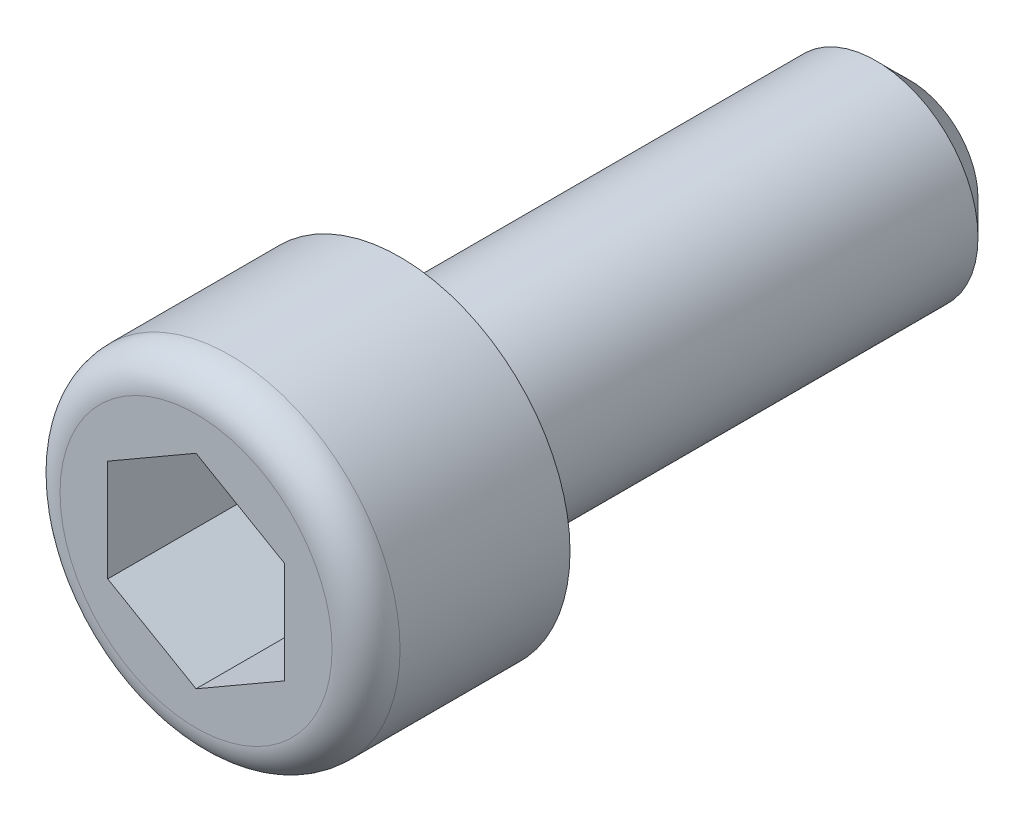
ISO-10303-21;
HEADER;
FILE_DESCRIPTION(('STEP AP214'),'2;1');
FILE_NAME('part.step','',(''),(''),'','','');
FILE_SCHEMA(('AUTOMOTIVE_DESIGN { 1 0 10303 214 1 1 1 1 }'));
ENDSEC;
DATA;
#1=APPLICATION_CONTEXT('core data for automotive mechanical design processes');
#2=APPLICATION_PROTOCOL_DEFINITION('international standard','automotive_design',2000,#1);
#3=PRODUCT_CONTEXT('',#1,'mechanical');
#4=PRODUCT('Part','Part','',(#3));
#5=PRODUCT_RELATED_PRODUCT_CATEGORY('part','',(#4));
#6=PRODUCT_DEFINITION_FORMATION('','',#4);
#7=PRODUCT_DEFINITION_CONTEXT('part definition',#1,'design');
#8=PRODUCT_DEFINITION('design','',#6,#7);
#9=PRODUCT_DEFINITION_SHAPE('','',#8);
#10=(LENGTH_UNIT() NAMED_UNIT(*) SI_UNIT(.MILLI.,.METRE.));
#11=(NAMED_UNIT(*) PLANE_ANGLE_UNIT() SI_UNIT($,.RADIAN.));
#12=(NAMED_UNIT(*) SI_UNIT($,.STERADIAN.) SOLID_ANGLE_UNIT());
#13=UNCERTAINTY_MEASURE_WITH_UNIT(LENGTH_MEASURE(1.E-05),#10,'distance_accuracy_value','');
#14=(GEOMETRIC_REPRESENTATION_CONTEXT(3) GLOBAL_UNCERTAINTY_ASSIGNED_CONTEXT((#13)) GLOBAL_UNIT_ASSIGNED_CONTEXT((#10,
#11,#12)) REPRESENTATION_CONTEXT('',''));
#15=CARTESIAN_POINT('',(0.,0.,0.));
#16=DIRECTION('',(0.,0.,1.));
#17=DIRECTION('',(1.,0.,0.));
#18=AXIS2_PLACEMENT_3D('',#15,#16,#17);
#19=CARTESIAN_POINT('',(0.,0.,0.));
#20=DIRECTION('',(0.,0.,-1.));
#21=DIRECTION('',(-1.,0.,0.));
#22=AXIS2_PLACEMENT_3D('',#19,#20,#21);
#23=PLANE('',#22);
#24=CARTESIAN_POINT('',(0.,0.,0.));
#25=DIRECTION('',(0.,0.,-1.));
#26=DIRECTION('',(-1.,0.,0.));
#27=AXIS2_PLACEMENT_3D('',#24,#25,#26);
#28=CIRCLE('',#27,4.);
#29=CARTESIAN_POINT('',(-4.,0.,0.));
#30=VERTEX_POINT('',#29);
#31=EDGE_CURVE('E40',#30,#30,#28,.F.);
#32=ORIENTED_EDGE('',*,*,#31,.T.);
#33=EDGE_LOOP('',(#32));
#34=FACE_BOUND('',#33,.T.);
#35=DIRECTION('',(-0.866025403784439,-0.5,0.));
#36=VECTOR('',#35,1.);
#37=CARTESIAN_POINT('',(0.,3.,0.));
#38=LINE('',#37,#36);
#39=CARTESIAN_POINT('',(0.,3.,0.));
#40=VERTEX_POINT('',#39);
#41=CARTESIAN_POINT('',(-2.59807621135332,1.5,0.));
#42=VERTEX_POINT('',#41);
#43=EDGE_CURVE('E121',#40,#42,#38,.T.);
#44=ORIENTED_EDGE('',*,*,#43,.F.);
#45=DIRECTION('',(-0.866025403784439,0.5,0.));
#46=VECTOR('',#45,1.);
#47=CARTESIAN_POINT('',(2.59807621135332,1.5,0.));
#48=LINE('',#47,#46);
#49=CARTESIAN_POINT('',(2.59807621135332,1.5,0.));
#50=VERTEX_POINT('',#49);
#51=EDGE_CURVE('E47',#50,#40,#48,.T.);
#52=ORIENTED_EDGE('',*,*,#51,.F.);
#53=DIRECTION('',(0.,1.,0.));
#54=VECTOR('',#53,1.);
#55=CARTESIAN_POINT('',(2.59807621135332,-1.5,0.));
#56=LINE('',#55,#54);
#57=CARTESIAN_POINT('',(2.59807621135332,-1.5,0.));
#58=VERTEX_POINT('',#57);
#59=EDGE_CURVE('E130',#58,#50,#56,.T.);
#60=ORIENTED_EDGE('',*,*,#59,.F.);
#61=DIRECTION('',(0.866025403784439,0.5,0.));
#62=VECTOR('',#61,1.);
#63=CARTESIAN_POINT('',(0.,-3.,0.));
#64=LINE('',#63,#62);
#65=CARTESIAN_POINT('',(0.,-3.,0.));
#66=VERTEX_POINT('',#65);
#67=EDGE_CURVE('E128',#66,#58,#64,.T.);
#68=ORIENTED_EDGE('',*,*,#67,.F.);
#69=DIRECTION('',(0.866025403784439,-0.5,0.));
#70=VECTOR('',#69,1.);
#71=CARTESIAN_POINT('',(-2.59807621135332,-1.5,0.));
#72=LINE('',#71,#70);
#73=CARTESIAN_POINT('',(-2.59807621135332,-1.5,0.));
#74=VERTEX_POINT('',#73);
#75=EDGE_CURVE('E95',#74,#66,#72,.T.);
#76=ORIENTED_EDGE('',*,*,#75,.F.);
#77=DIRECTION('',(0.,-1.,0.));
#78=VECTOR('',#77,1.);
#79=CARTESIAN_POINT('',(-2.59807621135332,1.5,0.));
#80=LINE('',#79,#78);
#81=EDGE_CURVE('E124',#42,#74,#80,.T.);
#82=ORIENTED_EDGE('',*,*,#81,.F.);
#83=EDGE_LOOP('',(#44,#52,#60,#68,#76,#82));
#84=FACE_BOUND('',#83,.T.);
#85=ADVANCED_FACE('F32',(#34,#84),#23,.F.);
#86=CARTESIAN_POINT('',(0.,0.,156.291575098795));
#87=DIRECTION('',(0.,0.,1.));
#88=DIRECTION('',(1.,0.,0.));
#89=AXIS2_PLACEMENT_3D('',#86,#87,#88);
#90=CYLINDRICAL_SURFACE('',#89,5.);
#91=CARTESIAN_POINT('',(0.,0.,-1.));
#92=DIRECTION('',(0.,0.,-1.));
#93=DIRECTION('',(-1.,0.,0.));
#94=AXIS2_PLACEMENT_3D('',#91,#92,#93);
#95=CIRCLE('',#94,5.);
#96=CARTESIAN_POINT('',(-5.,0.,-1.));
#97=VERTEX_POINT('',#96);
#98=EDGE_CURVE('E11',#97,#97,#95,.T.);
#99=ORIENTED_EDGE('',*,*,#98,.T.);
#100=EDGE_LOOP('',(#99));
#101=FACE_BOUND('',#100,.T.);
#102=CARTESIAN_POINT('',(0.,0.,-6.00000000000001));
#103=DIRECTION('',(0.,0.,1.));
#104=DIRECTION('',(1.,0.,0.));
#105=AXIS2_PLACEMENT_3D('',#102,#103,#104);
#106=CIRCLE('',#105,5.);
#107=CARTESIAN_POINT('',(5.,0.,-6.00000000000001));
#108=VERTEX_POINT('',#107);
#109=EDGE_CURVE('E142',#108,#108,#106,.T.);
#110=ORIENTED_EDGE('',*,*,#109,.T.);
#111=EDGE_LOOP('',(#110));
#112=FACE_BOUND('',#111,.T.);
#113=ADVANCED_FACE('F164',(#101,#112),#90,.T.);
#114=CARTESIAN_POINT('',(0.,5.,-6.));
#115=DIRECTION('',(0.,0.,1.));
#116=DIRECTION('',(1.,0.,0.));
#117=AXIS2_PLACEMENT_3D('',#114,#115,#116);
#118=PLANE('',#117);
#119=ORIENTED_EDGE('',*,*,#109,.F.);
#120=EDGE_LOOP('',(#119));
#121=FACE_BOUND('',#120,.T.);
#122=CARTESIAN_POINT('',(0.,0.,-6.00000000000001));
#123=DIRECTION('',(0.,0.,1.));
#124=DIRECTION('',(1.,0.,0.));
#125=AXIS2_PLACEMENT_3D('',#122,#123,#124);
#126=CIRCLE('',#125,3.);
#127=CARTESIAN_POINT('',(3.,0.,-6.00000000000001));
#128=VERTEX_POINT('',#127);
#129=EDGE_CURVE('E134',#128,#128,#126,.T.);
#130=ORIENTED_EDGE('',*,*,#129,.T.);
#131=EDGE_LOOP('',(#130));
#132=FACE_BOUND('',#131,.T.);
#133=ADVANCED_FACE('F169',(#121,#132),#118,.F.);
#134=CARTESIAN_POINT('',(0.,0.,156.291575098795));
#135=DIRECTION('',(0.,0.,1.));
#136=DIRECTION('',(1.,0.,0.));
#137=AXIS2_PLACEMENT_3D('',#134,#135,#136);
#138=CYLINDRICAL_SURFACE('',#137,3.);
#139=CARTESIAN_POINT('',(0.,0.,-20.));
#140=DIRECTION('',(0.,0.,1.));
#141=DIRECTION('',(1.,0.,0.));
#142=AXIS2_PLACEMENT_3D('',#139,#140,#141);
#143=CIRCLE('',#142,3.);
#144=CARTESIAN_POINT('',(3.,0.,-20.));
#145=VERTEX_POINT('',#144);
#146=EDGE_CURVE('E145',#145,#145,#143,.T.);
#147=ORIENTED_EDGE('',*,*,#146,.T.);
#148=EDGE_LOOP('',(#147));
#149=FACE_BOUND('',#148,.T.);
#150=ORIENTED_EDGE('',*,*,#129,.F.);
#151=EDGE_LOOP('',(#150));
#152=FACE_BOUND('',#151,.T.);
#153=ADVANCED_FACE('F175',(#149,#152),#138,.T.);
#154=CARTESIAN_POINT('',(0.,3.,-21.));
#155=DIRECTION('',(0.,0.,1.));
#156=DIRECTION('',(1.,0.,0.));
#157=AXIS2_PLACEMENT_3D('',#154,#155,#156);
#158=PLANE('',#157);
#159=CARTESIAN_POINT('',(0.,0.,-21.));
#160=DIRECTION('',(0.,0.,1.));
#161=DIRECTION('',(1.,0.,0.));
#162=AXIS2_PLACEMENT_3D('',#159,#160,#161);
#163=CIRCLE('',#162,1.99999999999997);
#164=CARTESIAN_POINT('',(1.99999999999997,0.,-21.));
#165=VERTEX_POINT('',#164);
#166=EDGE_CURVE('E148',#165,#165,#163,.F.);
#167=ORIENTED_EDGE('',*,*,#166,.T.);
#168=EDGE_LOOP('',(#167));
#169=FACE_BOUND('',#168,.T.);
#170=ADVANCED_FACE('F179',(#169),#158,.F.);
#171=CARTESIAN_POINT('',(2.59807621135332,1.5,-4.5));
#172=DIRECTION('',(0.5,0.866025403784439,0.));
#173=DIRECTION('',(-0.866025403784439,0.5,0.));
#174=AXIS2_PLACEMENT_3D('',#171,#172,#173);
#175=PLANE('',#174);
#176=ORIENTED_EDGE('',*,*,#51,.T.);
#177=DIRECTION('',(0.,0.,1.));
#178=VECTOR('',#177,1.);
#179=CARTESIAN_POINT('',(0.,3.,-4.5));
#180=LINE('',#179,#178);
#181=CARTESIAN_POINT('',(0.,3.,-4.5));
#182=VERTEX_POINT('',#181);
#183=EDGE_CURVE('E77',#182,#40,#180,.T.);
#184=ORIENTED_EDGE('',*,*,#183,.F.);
#185=DIRECTION('',(-0.866025403784439,0.5,0.));
#186=VECTOR('',#185,1.);
#187=CARTESIAN_POINT('',(2.59807621135332,1.5,-4.5));
#188=LINE('',#187,#186);
#189=CARTESIAN_POINT('',(2.59807621135332,1.5,-4.5));
#190=VERTEX_POINT('',#189);
#191=EDGE_CURVE('E132',#190,#182,#188,.T.);
#192=ORIENTED_EDGE('',*,*,#191,.F.);
#193=DIRECTION('',(0.,0.,1.));
#194=VECTOR('',#193,1.);
#195=CARTESIAN_POINT('',(2.59807621135332,1.5,-4.5));
#196=LINE('',#195,#194);
#197=EDGE_CURVE('E55',#190,#50,#196,.T.);
#198=ORIENTED_EDGE('',*,*,#197,.T.);
#199=EDGE_LOOP('',(#176,#184,#192,#198));
#200=FACE_BOUND('',#199,.T.);
#201=ADVANCED_FACE('F183',(#200),#175,.F.);
#202=CARTESIAN_POINT('',(2.59807621135332,-1.5,-4.5));
#203=DIRECTION('',(1.,0.,0.));
#204=DIRECTION('',(0.,1.,0.));
#205=AXIS2_PLACEMENT_3D('',#202,#203,#204);
#206=PLANE('',#205);
#207=ORIENTED_EDGE('',*,*,#59,.T.);
#208=ORIENTED_EDGE('',*,*,#197,.F.);
#209=DIRECTION('',(0.,1.,0.));
#210=VECTOR('',#209,1.);
#211=CARTESIAN_POINT('',(2.59807621135332,-1.5,-4.5));
#212=LINE('',#211,#210);
#213=CARTESIAN_POINT('',(2.59807621135332,-1.5,-4.5));
#214=VERTEX_POINT('',#213);
#215=EDGE_CURVE('E107',#214,#190,#212,.T.);
#216=ORIENTED_EDGE('',*,*,#215,.F.);
#217=DIRECTION('',(0.,0.,1.));
#218=VECTOR('',#217,1.);
#219=CARTESIAN_POINT('',(2.59807621135332,-1.5,-4.5));
#220=LINE('',#219,#218);
#221=EDGE_CURVE('E99',#214,#58,#220,.T.);
#222=ORIENTED_EDGE('',*,*,#221,.T.);
#223=EDGE_LOOP('',(#207,#208,#216,#222));
#224=FACE_BOUND('',#223,.T.);
#225=ADVANCED_FACE('F187',(#224),#206,.F.);
#226=CARTESIAN_POINT('',(0.,-3.,-4.5));
#227=DIRECTION('',(0.5,-0.866025403784439,0.));
#228=DIRECTION('',(0.866025403784439,0.5,0.));
#229=AXIS2_PLACEMENT_3D('',#226,#227,#228);
#230=PLANE('',#229);
#231=ORIENTED_EDGE('',*,*,#67,.T.);
#232=ORIENTED_EDGE('',*,*,#221,.F.);
#233=DIRECTION('',(0.866025403784439,0.5,0.));
#234=VECTOR('',#233,1.);
#235=CARTESIAN_POINT('',(0.,-3.,-4.5));
#236=LINE('',#235,#234);
#237=CARTESIAN_POINT('',(0.,-3.,-4.5));
#238=VERTEX_POINT('',#237);
#239=EDGE_CURVE('E103',#238,#214,#236,.T.);
#240=ORIENTED_EDGE('',*,*,#239,.F.);
#241=DIRECTION('',(0.,0.,1.));
#242=VECTOR('',#241,1.);
#243=CARTESIAN_POINT('',(0.,-3.,-4.5));
#244=LINE('',#243,#242);
#245=EDGE_CURVE('E88',#238,#66,#244,.T.);
#246=ORIENTED_EDGE('',*,*,#245,.T.);
#247=EDGE_LOOP('',(#231,#232,#240,#246));
#248=FACE_BOUND('',#247,.T.);
#249=ADVANCED_FACE('F104',(#248),#230,.F.);
#250=CARTESIAN_POINT('',(-2.59807621135332,-1.5,-4.5));
#251=DIRECTION('',(-0.5,-0.866025403784439,0.));
#252=DIRECTION('',(0.866025403784439,-0.5,0.));
#253=AXIS2_PLACEMENT_3D('',#250,#251,#252);
#254=PLANE('',#253);
#255=ORIENTED_EDGE('',*,*,#75,.T.);
#256=ORIENTED_EDGE('',*,*,#245,.F.);
#257=DIRECTION('',(0.866025403784439,-0.5,0.));
#258=VECTOR('',#257,1.);
#259=CARTESIAN_POINT('',(-2.59807621135332,-1.5,-4.5));
#260=LINE('',#259,#258);
#261=CARTESIAN_POINT('',(-2.59807621135332,-1.5,-4.5));
#262=VERTEX_POINT('',#261);
#263=EDGE_CURVE('E92',#262,#238,#260,.T.);
#264=ORIENTED_EDGE('',*,*,#263,.F.);
#265=DIRECTION('',(0.,0.,1.));
#266=VECTOR('',#265,1.);
#267=CARTESIAN_POINT('',(-2.59807621135332,-1.5,-4.5));
#268=LINE('',#267,#266);
#269=EDGE_CURVE('E100',#262,#74,#268,.T.);
#270=ORIENTED_EDGE('',*,*,#269,.T.);
#271=EDGE_LOOP('',(#255,#256,#264,#270));
#272=FACE_BOUND('',#271,.T.);
#273=ADVANCED_FACE('F90',(#272),#254,.F.);
#274=CARTESIAN_POINT('',(-2.59807621135332,1.5,-4.5));
#275=DIRECTION('',(-1.,0.,0.));
#276=DIRECTION('',(0.,-1.,0.));
#277=AXIS2_PLACEMENT_3D('',#274,#275,#276);
#278=PLANE('',#277);
#279=ORIENTED_EDGE('',*,*,#81,.T.);
#280=ORIENTED_EDGE('',*,*,#269,.F.);
#281=DIRECTION('',(0.,-1.,0.));
#282=VECTOR('',#281,1.);
#283=CARTESIAN_POINT('',(-2.59807621135332,1.5,-4.5));
#284=LINE('',#283,#282);
#285=CARTESIAN_POINT('',(-2.59807621135332,1.5,-4.5));
#286=VERTEX_POINT('',#285);
#287=EDGE_CURVE('E113',#286,#262,#284,.T.);
#288=ORIENTED_EDGE('',*,*,#287,.F.);
#289=DIRECTION('',(0.,0.,1.));
#290=VECTOR('',#289,1.);
#291=CARTESIAN_POINT('',(-2.59807621135332,1.5,-4.5));
#292=LINE('',#291,#290);
#293=EDGE_CURVE('E137',#286,#42,#292,.T.);
#294=ORIENTED_EDGE('',*,*,#293,.T.);
#295=EDGE_LOOP('',(#279,#280,#288,#294));
#296=FACE_BOUND('',#295,.T.);
#297=ADVANCED_FACE('F191',(#296),#278,.F.);
#298=CARTESIAN_POINT('',(0.,3.,-4.5));
#299=DIRECTION('',(-0.5,0.866025403784439,0.));
#300=DIRECTION('',(-0.866025403784439,-0.5,0.));
#301=AXIS2_PLACEMENT_3D('',#298,#299,#300);
#302=PLANE('',#301);
#303=ORIENTED_EDGE('',*,*,#43,.T.);
#304=ORIENTED_EDGE('',*,*,#293,.F.);
#305=DIRECTION('',(-0.866025403784439,-0.5,0.));
#306=VECTOR('',#305,1.);
#307=CARTESIAN_POINT('',(0.,3.,-4.5));
#308=LINE('',#307,#306);
#309=EDGE_CURVE('E115',#182,#286,#308,.T.);
#310=ORIENTED_EDGE('',*,*,#309,.F.);
#311=ORIENTED_EDGE('',*,*,#183,.T.);
#312=EDGE_LOOP('',(#303,#304,#310,#311));
#313=FACE_BOUND('',#312,.T.);
#314=ADVANCED_FACE('F188',(#313),#302,.F.);
#315=CARTESIAN_POINT('',(0.,0.,-4.5));
#316=DIRECTION('',(0.,0.,1.));
#317=DIRECTION('',(1.,0.,0.));
#318=AXIS2_PLACEMENT_3D('',#315,#316,#317);
#319=PLANE('',#318);
#320=ORIENTED_EDGE('',*,*,#191,.T.);
#321=ORIENTED_EDGE('',*,*,#309,.T.);
#322=ORIENTED_EDGE('',*,*,#287,.T.);
#323=ORIENTED_EDGE('',*,*,#263,.T.);
#324=ORIENTED_EDGE('',*,*,#239,.T.);
#325=ORIENTED_EDGE('',*,*,#215,.T.);
#326=EDGE_LOOP('',(#320,#321,#322,#323,#324,#325));
#327=FACE_BOUND('',#326,.T.);
#328=ADVANCED_FACE('F110',(#327),#319,.T.);
#329=CARTESIAN_POINT('',(0.,0.,-20.));
#330=DIRECTION('',(0.,0.,1.));
#331=DIRECTION('',(1.,0.,0.));
#332=AXIS2_PLACEMENT_3D('',#329,#330,#331);
#333=CONICAL_SURFACE('',#332,3.,0.785398163397459);
#334=ORIENTED_EDGE('',*,*,#166,.F.);
#335=EDGE_LOOP('',(#334));
#336=FACE_BOUND('',#335,.T.);
#337=ORIENTED_EDGE('',*,*,#146,.F.);
#338=EDGE_LOOP('',(#337));
#339=FACE_BOUND('',#338,.T.);
#340=ADVANCED_FACE('F156',(#336,#339),#333,.T.);
#341=CARTESIAN_POINT('',(0.,0.,-1.));
#342=DIRECTION('',(0.,0.,-1.));
#343=DIRECTION('',(-1.,0.,0.));
#344=AXIS2_PLACEMENT_3D('',#341,#342,#343);
#345=TOROIDAL_SURFACE('',#344,4.,1.);
#346=ORIENTED_EDGE('',*,*,#98,.F.);
#347=EDGE_LOOP('',(#346));
#348=FACE_BOUND('',#347,.T.);
#349=ORIENTED_EDGE('',*,*,#31,.F.);
#350=EDGE_LOOP('',(#349));
#351=FACE_BOUND('',#350,.T.);
#352=ADVANCED_FACE('F34',(#348,#351),#345,.T.);
#353=CLOSED_SHELL('',(#85,#113,#133,#153,#170,#201,#225,#249,#273,#297,#314,#328,#340,#352));
#354=MANIFOLD_SOLID_BREP('B2',#353);
#355=ADVANCED_BREP_SHAPE_REPRESENTATION('',(#18,#354),#14);
#356=SHAPE_DEFINITION_REPRESENTATION(#9,#355);
ENDSEC;
END-ISO-10303-21;
